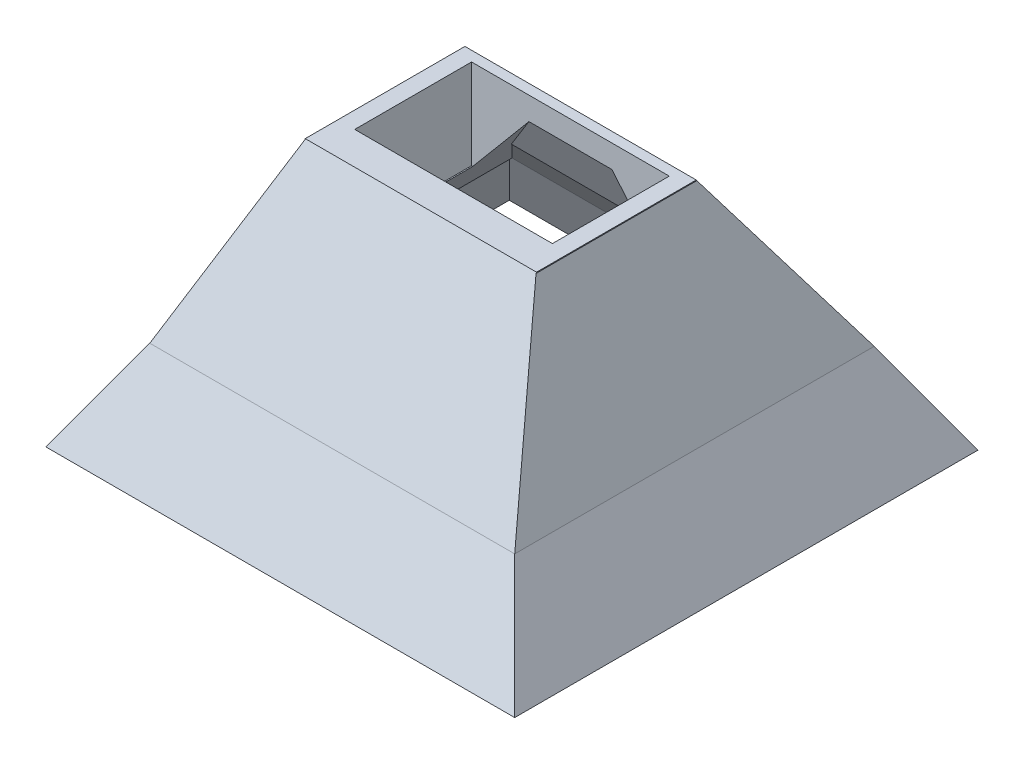
ISO-10303-21;
HEADER;
FILE_DESCRIPTION(('STEP AP214'),'2;1');
FILE_NAME('part.step','',(''),(''),'','','');
FILE_SCHEMA(('AUTOMOTIVE_DESIGN { 1 0 10303 214 1 1 1 1 }'));
ENDSEC;
DATA;
#1=APPLICATION_CONTEXT('core data for automotive mechanical design processes');
#2=APPLICATION_PROTOCOL_DEFINITION('international standard','automotive_design',2000,#1);
#3=PRODUCT_CONTEXT('',#1,'mechanical');
#4=PRODUCT('Part','Part','',(#3));
#5=PRODUCT_RELATED_PRODUCT_CATEGORY('part','',(#4));
#6=PRODUCT_DEFINITION_FORMATION('','',#4);
#7=PRODUCT_DEFINITION_CONTEXT('part definition',#1,'design');
#8=PRODUCT_DEFINITION('design','',#6,#7);
#9=PRODUCT_DEFINITION_SHAPE('','',#8);
#10=(LENGTH_UNIT() NAMED_UNIT(*) SI_UNIT(.MILLI.,.METRE.));
#11=(NAMED_UNIT(*) PLANE_ANGLE_UNIT() SI_UNIT($,.RADIAN.));
#12=(NAMED_UNIT(*) SI_UNIT($,.STERADIAN.) SOLID_ANGLE_UNIT());
#13=UNCERTAINTY_MEASURE_WITH_UNIT(LENGTH_MEASURE(1.E-05),#10,'distance_accuracy_value','');
#14=(GEOMETRIC_REPRESENTATION_CONTEXT(3) GLOBAL_UNCERTAINTY_ASSIGNED_CONTEXT((#13)) GLOBAL_UNIT_ASSIGNED_CONTEXT((#10,
#11,#12)) REPRESENTATION_CONTEXT('',''));
#15=CARTESIAN_POINT('',(0.,0.,0.));
#16=DIRECTION('',(0.,0.,1.));
#17=DIRECTION('',(1.,0.,0.));
#18=AXIS2_PLACEMENT_3D('',#15,#16,#17);
#19=CARTESIAN_POINT('',(0.,8.5,0.));
#20=DIRECTION('',(0.,-1.,0.));
#21=DIRECTION('',(0.,0.,-1.));
#22=AXIS2_PLACEMENT_3D('',#19,#20,#21);
#23=PLANE('',#22);
#24=DIRECTION('',(0.,0.,-1.));
#25=VECTOR('',#24,1.);
#26=CARTESIAN_POINT('',(-10.8676531349931,8.5,0.));
#27=LINE('',#26,#25);
#28=CARTESIAN_POINT('',(-10.8676531349931,8.5,10.8676531349931));
#29=VERTEX_POINT('',#28);
#30=CARTESIAN_POINT('',(-10.8676531349931,8.5,10.8));
#31=VERTEX_POINT('',#30);
#32=EDGE_CURVE('E426',#29,#31,#27,.T.);
#33=ORIENTED_EDGE('',*,*,#32,.T.);
#34=DIRECTION('',(1.,0.,0.));
#35=VECTOR('',#34,1.);
#36=CARTESIAN_POINT('',(10.8676531349931,8.5,10.8));
#37=LINE('',#36,#35);
#38=CARTESIAN_POINT('',(10.8676531349931,8.5,10.8));
#39=VERTEX_POINT('',#38);
#40=EDGE_CURVE('E485',#31,#39,#37,.T.);
#41=ORIENTED_EDGE('',*,*,#40,.T.);
#42=DIRECTION('',(0.,0.,1.));
#43=VECTOR('',#42,1.);
#44=CARTESIAN_POINT('',(10.8676531349931,8.5,0.));
#45=LINE('',#44,#43);
#46=CARTESIAN_POINT('',(10.8676531349931,8.5,10.8676531349931));
#47=VERTEX_POINT('',#46);
#48=EDGE_CURVE('E435',#39,#47,#45,.T.);
#49=ORIENTED_EDGE('',*,*,#48,.T.);
#50=DIRECTION('',(-1.,0.,0.));
#51=VECTOR('',#50,1.);
#52=CARTESIAN_POINT('',(0.,8.5,10.8676531349931));
#53=LINE('',#52,#51);
#54=EDGE_CURVE('E410',#47,#29,#53,.T.);
#55=ORIENTED_EDGE('',*,*,#54,.T.);
#56=EDGE_LOOP('',(#33,#41,#49,#55));
#57=FACE_BOUND('',#56,.T.);
#58=ADVANCED_FACE('F41',(#57),#23,.T.);
#59=CARTESIAN_POINT('',(18.,0.,-18.));
#60=DIRECTION('',(0.766044443118977,0.64278760968654,0.));
#61=DIRECTION('',(-0.64278760968654,0.766044443118977,0.));
#62=AXIS2_PLACEMENT_3D('',#59,#60,#61);
#63=PLANE('',#62);
#64=DIRECTION('',(0.540716203060937,-0.644400477571771,-0.540716203060937));
#65=VECTOR('',#64,1.);
#66=CARTESIAN_POINT('',(7.47453555890507,12.5437600613975,-7.47453555890508));
#67=LINE('',#66,#65);
#68=CARTESIAN_POINT('',(10.8676531349931,8.5,-10.8676531349931));
#69=VERTEX_POINT('',#68);
#70=CARTESIAN_POINT('',(18.,0.,-18.));
#71=VERTEX_POINT('',#70);
#72=EDGE_CURVE('E407',#69,#71,#67,.T.);
#73=ORIENTED_EDGE('',*,*,#72,.T.);
#74=DIRECTION('',(0.,0.,1.));
#75=VECTOR('',#74,1.);
#76=CARTESIAN_POINT('',(18.,0.,-18.));
#77=LINE('',#76,#75);
#78=CARTESIAN_POINT('',(18.,0.,18.));
#79=VERTEX_POINT('',#78);
#80=EDGE_CURVE('E236',#71,#79,#77,.T.);
#81=ORIENTED_EDGE('',*,*,#80,.T.);
#82=DIRECTION('',(0.540716203060937,-0.644400477571771,0.540716203060937));
#83=VECTOR('',#82,1.);
#84=CARTESIAN_POINT('',(7.47453555890506,12.5437600613975,7.47453555890507));
#85=LINE('',#84,#83);
#86=EDGE_CURVE('E406',#47,#79,#85,.T.);
#87=ORIENTED_EDGE('',*,*,#86,.F.);
#88=ORIENTED_EDGE('',*,*,#48,.F.);
#89=DIRECTION('',(-0.587858883152556,0.700582935935476,-0.404481746652007));
#90=VECTOR('',#89,1.);
#91=CARTESIAN_POINT('',(9.98509713369243,9.55178928521565,10.19274917305));
#92=LINE('',#91,#90);
#93=CARTESIAN_POINT('',(4.61819140160425,15.9478184725462,6.5));
#94=VERTEX_POINT('',#93);
#95=EDGE_CURVE('E51',#39,#94,#92,.T.);
#96=ORIENTED_EDGE('',*,*,#95,.T.);
#97=DIRECTION('',(-0.64278760968654,0.766044443118977,0.));
#98=VECTOR('',#97,1.);
#99=CARTESIAN_POINT('',(-3.09157313919248,25.1359580620961,6.5));
#100=LINE('',#99,#98);
#101=CARTESIAN_POINT('',(10.8676531349931,8.5,6.5));
#102=VERTEX_POINT('',#101);
#103=EDGE_CURVE('E474',#102,#94,#100,.T.);
#104=ORIENTED_EDGE('',*,*,#103,.F.);
#105=CARTESIAN_POINT('',(10.8676531349931,8.5,-6.5));
#106=VERTEX_POINT('',#105);
#107=EDGE_CURVE('E441',#106,#102,#45,.T.);
#108=ORIENTED_EDGE('',*,*,#107,.F.);
#109=DIRECTION('',(0.64278760968654,-0.766044443118977,0.));
#110=VECTOR('',#109,1.);
#111=CARTESIAN_POINT('',(-3.09157313919248,25.1359580620961,-6.5));
#112=LINE('',#111,#110);
#113=CARTESIAN_POINT('',(4.61819140160424,15.9478184725462,-6.5));
#114=VERTEX_POINT('',#113);
#115=EDGE_CURVE('E468',#114,#106,#112,.T.);
#116=ORIENTED_EDGE('',*,*,#115,.F.);
#117=DIRECTION('',(0.587858883152556,-0.700582935935476,-0.404481746652007));
#118=VECTOR('',#117,1.);
#119=CARTESIAN_POINT('',(18.5451118960204,-0.649639060448165,-16.0825465745377));
#120=LINE('',#119,#118);
#121=CARTESIAN_POINT('',(10.8676531349931,8.5,-10.8));
#122=VERTEX_POINT('',#121);
#123=EDGE_CURVE('E488',#114,#122,#120,.T.);
#124=ORIENTED_EDGE('',*,*,#123,.T.);
#125=EDGE_CURVE('E436',#69,#122,#45,.T.);
#126=ORIENTED_EDGE('',*,*,#125,.F.);
#127=EDGE_LOOP('',(#73,#81,#87,#88,#96,#104,#108,#116,#124,#126));
#128=FACE_BOUND('',#127,.T.);
#129=ADVANCED_FACE('F500',(#128),#63,.F.);
#130=CARTESIAN_POINT('',(-18.,0.,-18.));
#131=DIRECTION('',(0.,0.64278760968654,-0.766044443118977));
#132=DIRECTION('',(0.,0.766044443118977,0.64278760968654));
#133=AXIS2_PLACEMENT_3D('',#130,#131,#132);
#134=PLANE('',#133);
#135=DIRECTION('',(-0.540716203060937,-0.644400477571771,-0.540716203060937));
#136=VECTOR('',#135,1.);
#137=CARTESIAN_POINT('',(-18.,0.,-18.));
#138=LINE('',#137,#136);
#139=CARTESIAN_POINT('',(-10.8676531349931,8.5,-10.8676531349931));
#140=VERTEX_POINT('',#139);
#141=CARTESIAN_POINT('',(-18.,0.,-18.));
#142=VERTEX_POINT('',#141);
#143=EDGE_CURVE('E411',#140,#142,#138,.T.);
#144=ORIENTED_EDGE('',*,*,#143,.T.);
#145=DIRECTION('',(1.,0.,0.));
#146=VECTOR('',#145,1.);
#147=CARTESIAN_POINT('',(-18.,0.,-18.));
#148=LINE('',#147,#146);
#149=EDGE_CURVE('E402',#142,#71,#148,.T.);
#150=ORIENTED_EDGE('',*,*,#149,.T.);
#151=ORIENTED_EDGE('',*,*,#72,.F.);
#152=DIRECTION('',(1.,0.,0.));
#153=VECTOR('',#152,1.);
#154=CARTESIAN_POINT('',(0.,8.5,-10.8676531349931));
#155=LINE('',#154,#153);
#156=EDGE_CURVE('E430',#140,#69,#155,.T.);
#157=ORIENTED_EDGE('',*,*,#156,.F.);
#158=EDGE_LOOP('',(#144,#150,#151,#157));
#159=FACE_BOUND('',#158,.T.);
#160=ADVANCED_FACE('F581',(#159),#134,.F.);
#161=CARTESIAN_POINT('',(-18.,0.,-18.));
#162=DIRECTION('',(-0.766044443118977,0.64278760968654,0.));
#163=DIRECTION('',(-0.64278760968654,-0.766044443118977,0.));
#164=AXIS2_PLACEMENT_3D('',#161,#162,#163);
#165=PLANE('',#164);
#166=DIRECTION('',(-0.540716203060937,-0.644400477571771,0.540716203060937));
#167=VECTOR('',#166,1.);
#168=CARTESIAN_POINT('',(-18.,0.,18.));
#169=LINE('',#168,#167);
#170=CARTESIAN_POINT('',(-18.,0.,18.));
#171=VERTEX_POINT('',#170);
#172=EDGE_CURVE('E415',#29,#171,#169,.T.);
#173=ORIENTED_EDGE('',*,*,#172,.T.);
#174=DIRECTION('',(0.,0.,-1.));
#175=VECTOR('',#174,1.);
#176=CARTESIAN_POINT('',(-18.,0.,-18.));
#177=LINE('',#176,#175);
#178=EDGE_CURVE('E398',#171,#142,#177,.T.);
#179=ORIENTED_EDGE('',*,*,#178,.T.);
#180=ORIENTED_EDGE('',*,*,#143,.F.);
#181=CARTESIAN_POINT('',(-10.8676531349931,8.5,-10.8));
#182=VERTEX_POINT('',#181);
#183=EDGE_CURVE('E425',#182,#140,#27,.T.);
#184=ORIENTED_EDGE('',*,*,#183,.F.);
#185=DIRECTION('',(0.587858883152556,0.700582935935476,0.404481746652007));
#186=VECTOR('',#185,1.);
#187=CARTESIAN_POINT('',(-18.5451118960204,-0.649639060448165,-16.0825465745377));
#188=LINE('',#187,#186);
#189=CARTESIAN_POINT('',(-4.61819140160425,15.9478184725462,-6.5));
#190=VERTEX_POINT('',#189);
#191=EDGE_CURVE('E491',#182,#190,#188,.T.);
#192=ORIENTED_EDGE('',*,*,#191,.T.);
#193=DIRECTION('',(0.64278760968654,0.766044443118977,0.));
#194=VECTOR('',#193,1.);
#195=CARTESIAN_POINT('',(-5.99829690647131,14.3030727789618,-6.5));
#196=LINE('',#195,#194);
#197=CARTESIAN_POINT('',(-10.8676531349931,8.5,-6.5));
#198=VERTEX_POINT('',#197);
#199=EDGE_CURVE('E460',#198,#190,#196,.T.);
#200=ORIENTED_EDGE('',*,*,#199,.F.);
#201=CARTESIAN_POINT('',(-10.8676531349931,8.5,6.5));
#202=VERTEX_POINT('',#201);
#203=EDGE_CURVE('E431',#202,#198,#27,.T.);
#204=ORIENTED_EDGE('',*,*,#203,.F.);
#205=DIRECTION('',(-0.64278760968654,-0.766044443118977,0.));
#206=VECTOR('',#205,1.);
#207=CARTESIAN_POINT('',(-5.99829690647131,14.3030727789618,6.5));
#208=LINE('',#207,#206);
#209=CARTESIAN_POINT('',(-4.61819140160426,15.9478184725462,6.5));
#210=VERTEX_POINT('',#209);
#211=EDGE_CURVE('E482',#210,#202,#208,.T.);
#212=ORIENTED_EDGE('',*,*,#211,.F.);
#213=DIRECTION('',(-0.587858883152556,-0.700582935935476,0.404481746652007));
#214=VECTOR('',#213,1.);
#215=CARTESIAN_POINT('',(-9.98509713369243,9.55178928521565,10.19274917305));
#216=LINE('',#215,#214);
#217=EDGE_CURVE('E494',#210,#31,#216,.T.);
#218=ORIENTED_EDGE('',*,*,#217,.T.);
#219=ORIENTED_EDGE('',*,*,#32,.F.);
#220=EDGE_LOOP('',(#173,#179,#180,#184,#192,#200,#204,#212,#218,#219));
#221=FACE_BOUND('',#220,.T.);
#222=ADVANCED_FACE('F514',(#221),#165,.F.);
#223=CARTESIAN_POINT('',(-18.,0.,18.));
#224=DIRECTION('',(0.,0.64278760968654,0.766044443118977));
#225=DIRECTION('',(0.,-0.766044443118977,0.64278760968654));
#226=AXIS2_PLACEMENT_3D('',#223,#224,#225);
#227=PLANE('',#226);
#228=ORIENTED_EDGE('',*,*,#86,.T.);
#229=DIRECTION('',(-1.,0.,0.));
#230=VECTOR('',#229,1.);
#231=CARTESIAN_POINT('',(-18.,0.,18.));
#232=LINE('',#231,#230);
#233=EDGE_CURVE('E394',#79,#171,#232,.T.);
#234=ORIENTED_EDGE('',*,*,#233,.T.);
#235=ORIENTED_EDGE('',*,*,#172,.F.);
#236=ORIENTED_EDGE('',*,*,#54,.F.);
#237=EDGE_LOOP('',(#228,#234,#235,#236));
#238=FACE_BOUND('',#237,.T.);
#239=ADVANCED_FACE('F532',(#238),#227,.F.);
#240=ORIENTED_EDGE('',*,*,#125,.T.);
#241=DIRECTION('',(-1.,0.,0.));
#242=VECTOR('',#241,1.);
#243=CARTESIAN_POINT('',(-10.8676531349931,8.5,-10.8));
#244=LINE('',#243,#242);
#245=EDGE_CURVE('E471',#122,#182,#244,.T.);
#246=ORIENTED_EDGE('',*,*,#245,.T.);
#247=ORIENTED_EDGE('',*,*,#183,.T.);
#248=ORIENTED_EDGE('',*,*,#156,.T.);
#249=EDGE_LOOP('',(#240,#246,#247,#248));
#250=FACE_BOUND('',#249,.T.);
#251=ADVANCED_FACE('F550',(#250),#23,.T.);
#252=CARTESIAN_POINT('',(12.8676531349931,18.5,12.8676531349931));
#253=DIRECTION('',(-1.,0.,0.));
#254=DIRECTION('',(0.,0.,1.));
#255=AXIS2_PLACEMENT_3D('',#252,#253,#254);
#256=PLANE('',#255);
#257=DIRECTION('',(0.,0.,-1.));
#258=VECTOR('',#257,1.);
#259=CARTESIAN_POINT('',(12.8676531349931,18.398928629861,-12.8676531349931));
#260=LINE('',#259,#258);
#261=CARTESIAN_POINT('',(12.8676531349931,18.398928629861,10.1938683086254));
#262=VERTEX_POINT('',#261);
#263=CARTESIAN_POINT('',(12.8676531349931,18.398928629861,-7.69758123506049));
#264=VERTEX_POINT('',#263);
#265=EDGE_CURVE('E440',#262,#264,#260,.T.);
#266=ORIENTED_EDGE('',*,*,#265,.T.);
#267=DIRECTION('',(0.,0.831289081728702,0.555840321134273));
#268=VECTOR('',#267,1.);
#269=CARTESIAN_POINT('',(12.8676531349931,27.9712273961323,-1.29707660053211));
#270=LINE('',#269,#268);
#271=CARTESIAN_POINT('',(12.8676531349931,18.5,-7.63));
#272=VERTEX_POINT('',#271);
#273=EDGE_CURVE('E66',#264,#272,#270,.T.);
#274=ORIENTED_EDGE('',*,*,#273,.T.);
#275=DIRECTION('',(0.,0.,-1.));
#276=VECTOR('',#275,1.);
#277=CARTESIAN_POINT('',(12.8676531349931,18.5,12.8676531349931));
#278=LINE('',#277,#276);
#279=CARTESIAN_POINT('',(12.8676531349931,18.5,10.14));
#280=VERTEX_POINT('',#279);
#281=EDGE_CURVE('E376',#280,#272,#278,.T.);
#282=ORIENTED_EDGE('',*,*,#281,.F.);
#283=DIRECTION('',(0.,-0.88248495319256,0.470340629106954));
#284=VECTOR('',#283,1.);
#285=CARTESIAN_POINT('',(12.8676531349931,17.3678370281947,10.743412264973));
#286=LINE('',#285,#284);
#287=EDGE_CURVE('E323',#280,#262,#286,.T.);
#288=ORIENTED_EDGE('',*,*,#287,.T.);
#289=EDGE_LOOP('',(#266,#274,#282,#288));
#290=FACE_BOUND('',#289,.T.);
#291=ADVANCED_FACE('F586',(#290),#256,.F.);
#292=CARTESIAN_POINT('',(-12.8676531349931,18.5,12.8676531349931));
#293=DIRECTION('',(1.,0.,0.));
#294=DIRECTION('',(0.,0.,-1.));
#295=AXIS2_PLACEMENT_3D('',#292,#293,#294);
#296=PLANE('',#295);
#297=DIRECTION('',(0.,0.,1.));
#298=VECTOR('',#297,1.);
#299=CARTESIAN_POINT('',(-12.8676531349931,18.5,12.8676531349931));
#300=LINE('',#299,#298);
#301=CARTESIAN_POINT('',(-12.8676531349931,18.5,-7.63));
#302=VERTEX_POINT('',#301);
#303=CARTESIAN_POINT('',(-12.8676531349931,18.5,10.14));
#304=VERTEX_POINT('',#303);
#305=EDGE_CURVE('E389',#302,#304,#300,.T.);
#306=ORIENTED_EDGE('',*,*,#305,.F.);
#307=DIRECTION('',(0.,-0.831289081728702,-0.555840321134273));
#308=VECTOR('',#307,1.);
#309=CARTESIAN_POINT('',(-12.8676531349931,27.9712273961323,-1.29707660053211));
#310=LINE('',#309,#308);
#311=CARTESIAN_POINT('',(-12.8676531349931,18.398928629861,-7.69758123506048));
#312=VERTEX_POINT('',#311);
#313=EDGE_CURVE('E314',#302,#312,#310,.T.);
#314=ORIENTED_EDGE('',*,*,#313,.T.);
#315=DIRECTION('',(0.,0.,1.));
#316=VECTOR('',#315,1.);
#317=CARTESIAN_POINT('',(-12.8676531349931,18.398928629861,12.8676531349931));
#318=LINE('',#317,#316);
#319=CARTESIAN_POINT('',(-12.8676531349931,18.398928629861,10.1938683086254));
#320=VERTEX_POINT('',#319);
#321=EDGE_CURVE('E445',#312,#320,#318,.T.);
#322=ORIENTED_EDGE('',*,*,#321,.T.);
#323=DIRECTION('',(0.,0.88248495319256,-0.470340629106954));
#324=VECTOR('',#323,1.);
#325=CARTESIAN_POINT('',(-12.8676531349931,17.3678370281947,10.743412264973));
#326=LINE('',#325,#324);
#327=EDGE_CURVE('E333',#320,#304,#326,.T.);
#328=ORIENTED_EDGE('',*,*,#327,.T.);
#329=EDGE_LOOP('',(#306,#314,#322,#328));
#330=FACE_BOUND('',#329,.T.);
#331=ADVANCED_FACE('F591',(#330),#296,.F.);
#332=CARTESIAN_POINT('',(0.,18.5,0.));
#333=DIRECTION('',(0.,-1.,0.));
#334=DIRECTION('',(0.,0.,-1.));
#335=AXIS2_PLACEMENT_3D('',#332,#333,#334);
#336=PLANE('',#335);
#337=DIRECTION('',(1.,0.,0.));
#338=VECTOR('',#337,1.);
#339=CARTESIAN_POINT('',(-11.,18.5,-6.5));
#340=LINE('',#339,#338);
#341=CARTESIAN_POINT('',(-11.,18.5,-6.5));
#342=VERTEX_POINT('',#341);
#343=CARTESIAN_POINT('',(11.,18.5,-6.5));
#344=VERTEX_POINT('',#343);
#345=EDGE_CURVE('E351',#342,#344,#340,.T.);
#346=ORIENTED_EDGE('',*,*,#345,.T.);
#347=DIRECTION('',(0.,0.,1.));
#348=VECTOR('',#347,1.);
#349=CARTESIAN_POINT('',(11.,18.5,-6.5));
#350=LINE('',#349,#348);
#351=CARTESIAN_POINT('',(11.,18.5,6.5));
#352=VERTEX_POINT('',#351);
#353=EDGE_CURVE('E338',#344,#352,#350,.T.);
#354=ORIENTED_EDGE('',*,*,#353,.T.);
#355=DIRECTION('',(-1.,0.,0.));
#356=VECTOR('',#355,1.);
#357=CARTESIAN_POINT('',(-11.,18.5,6.5));
#358=LINE('',#357,#356);
#359=CARTESIAN_POINT('',(-11.,18.5,6.5));
#360=VERTEX_POINT('',#359);
#361=EDGE_CURVE('E342',#352,#360,#358,.T.);
#362=ORIENTED_EDGE('',*,*,#361,.T.);
#363=DIRECTION('',(0.,0.,-1.));
#364=VECTOR('',#363,1.);
#365=CARTESIAN_POINT('',(-11.,18.5,-6.5));
#366=LINE('',#365,#364);
#367=EDGE_CURVE('E347',#360,#342,#366,.T.);
#368=ORIENTED_EDGE('',*,*,#367,.T.);
#369=EDGE_LOOP('',(#346,#354,#362,#368));
#370=FACE_BOUND('',#369,.T.);
#371=ORIENTED_EDGE('',*,*,#281,.T.);
#372=DIRECTION('',(1.,0.,0.));
#373=VECTOR('',#372,1.);
#374=CARTESIAN_POINT('',(-20.3013028287262,18.5,-7.63));
#375=LINE('',#374,#373);
#376=EDGE_CURVE('E303',#302,#272,#375,.T.);
#377=ORIENTED_EDGE('',*,*,#376,.F.);
#378=ORIENTED_EDGE('',*,*,#305,.T.);
#379=DIRECTION('',(1.,0.,0.));
#380=VECTOR('',#379,1.);
#381=CARTESIAN_POINT('',(-20.3013028287262,18.5,10.14));
#382=LINE('',#381,#380);
#383=EDGE_CURVE('E319',#304,#280,#382,.T.);
#384=ORIENTED_EDGE('',*,*,#383,.T.);
#385=EDGE_LOOP('',(#371,#377,#378,#384));
#386=FACE_BOUND('',#385,.T.);
#387=ADVANCED_FACE('F562',(#370,#386),#336,.F.);
#388=CARTESIAN_POINT('',(0.,8.5,0.));
#389=DIRECTION('',(0.,1.,0.));
#390=DIRECTION('',(0.,0.,1.));
#391=AXIS2_PLACEMENT_3D('',#388,#389,#390);
#392=PLANE('',#391);
#393=ORIENTED_EDGE('',*,*,#203,.T.);
#394=DIRECTION('',(1.,0.,0.));
#395=VECTOR('',#394,1.);
#396=CARTESIAN_POINT('',(-11.,8.5,-6.5));
#397=LINE('',#396,#395);
#398=CARTESIAN_POINT('',(-11.,8.5,-6.5));
#399=VERTEX_POINT('',#398);
#400=EDGE_CURVE('E343',#399,#198,#397,.T.);
#401=ORIENTED_EDGE('',*,*,#400,.F.);
#402=DIRECTION('',(0.,0.,-1.));
#403=VECTOR('',#402,1.);
#404=CARTESIAN_POINT('',(-11.,8.5,-6.5));
#405=LINE('',#404,#403);
#406=CARTESIAN_POINT('',(-11.,8.5,6.5));
#407=VERTEX_POINT('',#406);
#408=EDGE_CURVE('E364',#407,#399,#405,.T.);
#409=ORIENTED_EDGE('',*,*,#408,.F.);
#410=DIRECTION('',(-1.,0.,0.));
#411=VECTOR('',#410,1.);
#412=CARTESIAN_POINT('',(-11.,8.5,6.5));
#413=LINE('',#412,#411);
#414=EDGE_CURVE('E359',#202,#407,#413,.T.);
#415=ORIENTED_EDGE('',*,*,#414,.F.);
#416=EDGE_LOOP('',(#393,#401,#409,#415));
#417=FACE_BOUND('',#416,.T.);
#418=ADVANCED_FACE('F520',(#417),#392,.T.);
#419=ORIENTED_EDGE('',*,*,#107,.T.);
#420=CARTESIAN_POINT('',(11.,8.5,6.5));
#421=VERTEX_POINT('',#420);
#422=EDGE_CURVE('E360',#421,#102,#413,.T.);
#423=ORIENTED_EDGE('',*,*,#422,.F.);
#424=DIRECTION('',(0.,0.,1.));
#425=VECTOR('',#424,1.);
#426=CARTESIAN_POINT('',(11.,8.5,-6.5));
#427=LINE('',#426,#425);
#428=CARTESIAN_POINT('',(11.,8.5,-6.5));
#429=VERTEX_POINT('',#428);
#430=EDGE_CURVE('E337',#429,#421,#427,.T.);
#431=ORIENTED_EDGE('',*,*,#430,.F.);
#432=EDGE_CURVE('E368',#106,#429,#397,.T.);
#433=ORIENTED_EDGE('',*,*,#432,.F.);
#434=EDGE_LOOP('',(#419,#423,#431,#433));
#435=FACE_BOUND('',#434,.T.);
#436=ADVANCED_FACE('F538',(#435),#392,.T.);
#437=CARTESIAN_POINT('',(11.,18.5,-6.5));
#438=DIRECTION('',(1.,0.,0.));
#439=DIRECTION('',(0.,0.,-1.));
#440=AXIS2_PLACEMENT_3D('',#437,#438,#439);
#441=PLANE('',#440);
#442=ORIENTED_EDGE('',*,*,#430,.T.);
#443=DIRECTION('',(0.,-1.,0.));
#444=VECTOR('',#443,1.);
#445=CARTESIAN_POINT('',(11.,18.5,6.5));
#446=LINE('',#445,#444);
#447=EDGE_CURVE('E355',#352,#421,#446,.T.);
#448=ORIENTED_EDGE('',*,*,#447,.F.);
#449=ORIENTED_EDGE('',*,*,#353,.F.);
#450=DIRECTION('',(0.,-1.,0.));
#451=VECTOR('',#450,1.);
#452=CARTESIAN_POINT('',(11.,18.5,-6.5));
#453=LINE('',#452,#451);
#454=EDGE_CURVE('E372',#344,#429,#453,.T.);
#455=ORIENTED_EDGE('',*,*,#454,.T.);
#456=EDGE_LOOP('',(#442,#448,#449,#455));
#457=FACE_BOUND('',#456,.T.);
#458=ADVANCED_FACE('F559',(#457),#441,.F.);
#459=CARTESIAN_POINT('',(-11.,18.5,-6.5));
#460=DIRECTION('',(0.,0.,-1.));
#461=DIRECTION('',(-1.,0.,0.));
#462=AXIS2_PLACEMENT_3D('',#459,#460,#461);
#463=PLANE('',#462);
#464=DIRECTION('',(1.,0.,0.));
#465=VECTOR('',#464,1.);
#466=CARTESIAN_POINT('',(10.8676531349931,15.9478184725462,-6.5));
#467=LINE('',#466,#465);
#468=EDGE_CURVE('E464',#190,#114,#467,.T.);
#469=ORIENTED_EDGE('',*,*,#468,.T.);
#470=ORIENTED_EDGE('',*,*,#115,.T.);
#471=ORIENTED_EDGE('',*,*,#432,.T.);
#472=ORIENTED_EDGE('',*,*,#454,.F.);
#473=ORIENTED_EDGE('',*,*,#345,.F.);
#474=DIRECTION('',(0.,-1.,0.));
#475=VECTOR('',#474,1.);
#476=CARTESIAN_POINT('',(-11.,18.5,-6.5));
#477=LINE('',#476,#475);
#478=EDGE_CURVE('E377',#342,#399,#477,.T.);
#479=ORIENTED_EDGE('',*,*,#478,.T.);
#480=ORIENTED_EDGE('',*,*,#400,.T.);
#481=ORIENTED_EDGE('',*,*,#199,.T.);
#482=EDGE_LOOP('',(#469,#470,#471,#472,#473,#479,#480,#481));
#483=FACE_BOUND('',#482,.T.);
#484=ADVANCED_FACE('F543',(#483),#463,.F.);
#485=CARTESIAN_POINT('',(-11.,18.5,-6.5));
#486=DIRECTION('',(-1.,0.,0.));
#487=DIRECTION('',(0.,0.,1.));
#488=AXIS2_PLACEMENT_3D('',#485,#486,#487);
#489=PLANE('',#488);
#490=ORIENTED_EDGE('',*,*,#408,.T.);
#491=ORIENTED_EDGE('',*,*,#478,.F.);
#492=ORIENTED_EDGE('',*,*,#367,.F.);
#493=DIRECTION('',(0.,-1.,0.));
#494=VECTOR('',#493,1.);
#495=CARTESIAN_POINT('',(-11.,18.5,6.5));
#496=LINE('',#495,#494);
#497=EDGE_CURVE('E380',#360,#407,#496,.T.);
#498=ORIENTED_EDGE('',*,*,#497,.T.);
#499=EDGE_LOOP('',(#490,#491,#492,#498));
#500=FACE_BOUND('',#499,.T.);
#501=ADVANCED_FACE('F565',(#500),#489,.F.);
#502=CARTESIAN_POINT('',(-11.,18.5,6.5));
#503=DIRECTION('',(0.,0.,1.));
#504=DIRECTION('',(1.,0.,0.));
#505=AXIS2_PLACEMENT_3D('',#502,#503,#504);
#506=PLANE('',#505);
#507=DIRECTION('',(-1.,0.,0.));
#508=VECTOR('',#507,1.);
#509=CARTESIAN_POINT('',(-10.8676531349931,15.9478184725462,6.5));
#510=LINE('',#509,#508);
#511=EDGE_CURVE('E478',#94,#210,#510,.T.);
#512=ORIENTED_EDGE('',*,*,#511,.T.);
#513=ORIENTED_EDGE('',*,*,#211,.T.);
#514=ORIENTED_EDGE('',*,*,#414,.T.);
#515=ORIENTED_EDGE('',*,*,#497,.F.);
#516=ORIENTED_EDGE('',*,*,#361,.F.);
#517=ORIENTED_EDGE('',*,*,#447,.T.);
#518=ORIENTED_EDGE('',*,*,#422,.T.);
#519=ORIENTED_EDGE('',*,*,#103,.T.);
#520=EDGE_LOOP('',(#512,#513,#514,#515,#516,#517,#518,#519));
#521=FACE_BOUND('',#520,.T.);
#522=ADVANCED_FACE('F507',(#521),#506,.F.);
#523=CARTESIAN_POINT('',(-12.8676531349931,18.398928629861,12.8676531349931));
#524=DIRECTION('',(0.927183854566789,-0.374606593415909,0.));
#525=DIRECTION('',(0.,0.,1.));
#526=AXIS2_PLACEMENT_3D('',#523,#524,#525);
#527=PLANE('',#526);
#528=ORIENTED_EDGE('',*,*,#321,.F.);
#529=DIRECTION('',(-0.318384822463637,-0.788030088407036,-0.52691525370784));
#530=VECTOR('',#529,1.);
#531=CARTESIAN_POINT('',(-9.417591998523,26.9381295922207,-1.98785605103943));
#532=LINE('',#531,#530);
#533=CARTESIAN_POINT('',(-20.3013028287262,0.,-20.));
#534=VERTEX_POINT('',#533);
#535=EDGE_CURVE('E311',#312,#534,#532,.T.);
#536=ORIENTED_EDGE('',*,*,#535,.T.);
#537=DIRECTION('',(0.,0.,-1.));
#538=VECTOR('',#537,1.);
#539=CARTESIAN_POINT('',(-20.3013028287262,0.,12.8676531349931));
#540=LINE('',#539,#538);
#541=CARTESIAN_POINT('',(-20.3013028287262,0.,20.));
#542=VERTEX_POINT('',#541);
#543=EDGE_CURVE('E452',#542,#534,#540,.T.);
#544=ORIENTED_EDGE('',*,*,#543,.F.);
#545=DIRECTION('',(0.335838644601319,0.83122981412188,-0.44302302525631));
#546=VECTOR('',#545,1.);
#547=CARTESIAN_POINT('',(-13.2654702112735,17.4142968142949,10.7186504546515));
#548=LINE('',#547,#546);
#549=EDGE_CURVE('E329',#542,#320,#548,.T.);
#550=ORIENTED_EDGE('',*,*,#549,.T.);
#551=EDGE_LOOP('',(#528,#536,#544,#550));
#552=FACE_BOUND('',#551,.T.);
#553=ADVANCED_FACE('F572',(#552),#527,.F.);
#554=CARTESIAN_POINT('',(12.8676531349931,18.398928629861,12.8676531349931));
#555=DIRECTION('',(-0.927183854566789,-0.374606593415909,0.));
#556=DIRECTION('',(0.,0.,-1.));
#557=AXIS2_PLACEMENT_3D('',#554,#555,#556);
#558=PLANE('',#557);
#559=DIRECTION('',(0.,0.,1.));
#560=VECTOR('',#559,1.);
#561=CARTESIAN_POINT('',(20.3013028287262,0.,12.8676531349931));
#562=LINE('',#561,#560);
#563=CARTESIAN_POINT('',(20.3013028287262,0.,-20.));
#564=VERTEX_POINT('',#563);
#565=CARTESIAN_POINT('',(20.3013028287262,0.,20.));
#566=VERTEX_POINT('',#565);
#567=EDGE_CURVE('E448',#564,#566,#562,.T.);
#568=ORIENTED_EDGE('',*,*,#567,.F.);
#569=DIRECTION('',(-0.318384822463637,0.788030088407036,0.52691525370784));
#570=VECTOR('',#569,1.);
#571=CARTESIAN_POINT('',(9.417591998523,26.9381295922207,-1.98785605103944));
#572=LINE('',#571,#570);
#573=EDGE_CURVE('E11',#564,#264,#572,.T.);
#574=ORIENTED_EDGE('',*,*,#573,.T.);
#575=ORIENTED_EDGE('',*,*,#265,.F.);
#576=DIRECTION('',(0.335838644601319,-0.83122981412188,0.44302302525631));
#577=VECTOR('',#576,1.);
#578=CARTESIAN_POINT('',(13.2654702112735,17.4142968142949,10.7186504546515));
#579=LINE('',#578,#577);
#580=EDGE_CURVE('E456',#262,#566,#579,.T.);
#581=ORIENTED_EDGE('',*,*,#580,.T.);
#582=EDGE_LOOP('',(#568,#574,#575,#581));
#583=FACE_BOUND('',#582,.T.);
#584=ADVANCED_FACE('F605',(#583),#558,.F.);
#585=CARTESIAN_POINT('',(-20.3013028287262,18.5,10.14));
#586=DIRECTION('',(0.,-0.470340629106954,-0.88248495319256));
#587=DIRECTION('',(0.,0.88248495319256,-0.470340629106954));
#588=AXIS2_PLACEMENT_3D('',#585,#586,#587);
#589=PLANE('',#588);
#590=ORIENTED_EDGE('',*,*,#549,.F.);
#591=DIRECTION('',(1.,0.,0.));
#592=VECTOR('',#591,1.);
#593=CARTESIAN_POINT('',(-20.3013028287262,0.,20.));
#594=LINE('',#593,#592);
#595=EDGE_CURVE('E318',#542,#566,#594,.T.);
#596=ORIENTED_EDGE('',*,*,#595,.T.);
#597=ORIENTED_EDGE('',*,*,#580,.F.);
#598=ORIENTED_EDGE('',*,*,#287,.F.);
#599=ORIENTED_EDGE('',*,*,#383,.F.);
#600=ORIENTED_EDGE('',*,*,#327,.F.);
#601=EDGE_LOOP('',(#590,#596,#597,#598,#599,#600));
#602=FACE_BOUND('',#601,.T.);
#603=ADVANCED_FACE('F612',(#602),#589,.F.);
#604=CARTESIAN_POINT('',(-11.,15.9478184725462,-6.5));
#605=DIRECTION('',(0.,-0.500000000000001,0.866025403784438));
#606=DIRECTION('',(-1.,0.,0.));
#607=AXIS2_PLACEMENT_3D('',#604,#605,#606);
#608=PLANE('',#607);
#609=ORIENTED_EDGE('',*,*,#191,.F.);
#610=ORIENTED_EDGE('',*,*,#245,.F.);
#611=ORIENTED_EDGE('',*,*,#123,.F.);
#612=ORIENTED_EDGE('',*,*,#468,.F.);
#613=EDGE_LOOP('',(#609,#610,#611,#612));
#614=FACE_BOUND('',#613,.T.);
#615=ADVANCED_FACE('F546',(#614),#608,.T.);
#616=CARTESIAN_POINT('',(-11.,15.9478184725462,6.5));
#617=DIRECTION('',(0.,-0.500000000000001,-0.866025403784438));
#618=DIRECTION('',(1.,0.,0.));
#619=AXIS2_PLACEMENT_3D('',#616,#617,#618);
#620=PLANE('',#619);
#621=ORIENTED_EDGE('',*,*,#95,.F.);
#622=ORIENTED_EDGE('',*,*,#40,.F.);
#623=ORIENTED_EDGE('',*,*,#217,.F.);
#624=ORIENTED_EDGE('',*,*,#511,.F.);
#625=EDGE_LOOP('',(#621,#622,#623,#624));
#626=FACE_BOUND('',#625,.T.);
#627=ADVANCED_FACE('F44',(#626),#620,.T.);
#628=CARTESIAN_POINT('',(-20.3013028287262,0.,-20.));
#629=DIRECTION('',(0.,-0.555840321134273,0.831289081728702));
#630=DIRECTION('',(0.,-0.831289081728702,-0.555840321134273));
#631=AXIS2_PLACEMENT_3D('',#628,#629,#630);
#632=PLANE('',#631);
#633=ORIENTED_EDGE('',*,*,#376,.T.);
#634=ORIENTED_EDGE('',*,*,#273,.F.);
#635=ORIENTED_EDGE('',*,*,#573,.F.);
#636=DIRECTION('',(1.,0.,0.));
#637=VECTOR('',#636,1.);
#638=CARTESIAN_POINT('',(-20.3013028287262,0.,-20.));
#639=LINE('',#638,#637);
#640=EDGE_CURVE('E278',#534,#564,#639,.T.);
#641=ORIENTED_EDGE('',*,*,#640,.F.);
#642=ORIENTED_EDGE('',*,*,#535,.F.);
#643=ORIENTED_EDGE('',*,*,#313,.F.);
#644=EDGE_LOOP('',(#633,#634,#635,#641,#642,#643));
#645=FACE_BOUND('',#644,.T.);
#646=ADVANCED_FACE('F625',(#645),#632,.F.);
#647=CARTESIAN_POINT('',(20.3013028287262,0.,-20.));
#648=DIRECTION('',(0.866025403784438,0.500000000000001,0.));
#649=DIRECTION('',(-0.500000000000001,0.866025403784438,0.));
#650=AXIS2_PLACEMENT_3D('',#647,#648,#649);
#651=PLANE('',#650);
#652=ORIENTED_EDGE('',*,*,#567,.T.);
#653=DIRECTION('',(-0.447213595499959,0.774596669241482,-0.447213595499959));
#654=VECTOR('',#653,1.);
#655=CARTESIAN_POINT('',(12.1807816972357,14.0651551836782,11.8794788685095));
#656=LINE('',#655,#654);
#657=CARTESIAN_POINT('',(26.0748055206225,-10.,25.7735026918963));
#658=VERTEX_POINT('',#657);
#659=EDGE_CURVE('E274',#658,#566,#656,.T.);
#660=ORIENTED_EDGE('',*,*,#659,.F.);
#661=DIRECTION('',(0.,0.,-1.));
#662=VECTOR('',#661,1.);
#663=CARTESIAN_POINT('',(26.0748055206225,-10.,0.));
#664=LINE('',#663,#662);
#665=CARTESIAN_POINT('',(26.0748055206225,-10.,-25.7735026918963));
#666=VERTEX_POINT('',#665);
#667=EDGE_CURVE('E258',#666,#658,#664,.F.);
#668=ORIENTED_EDGE('',*,*,#667,.F.);
#669=DIRECTION('',(-0.447213595499959,0.774596669241482,0.447213595499959));
#670=VECTOR('',#669,1.);
#671=CARTESIAN_POINT('',(20.3013028287262,0.,-20.));
#672=LINE('',#671,#670);
#673=EDGE_CURVE('E280',#666,#564,#672,.T.);
#674=ORIENTED_EDGE('',*,*,#673,.T.);
#675=EDGE_LOOP('',(#652,#660,#668,#674));
#676=FACE_BOUND('',#675,.T.);
#677=ADVANCED_FACE('F779',(#676),#651,.T.);
#678=CARTESIAN_POINT('',(-20.3013028287262,0.,20.));
#679=DIRECTION('',(0.,0.500000000000001,0.866025403784438));
#680=DIRECTION('',(0.,-0.866025403784438,0.500000000000001));
#681=AXIS2_PLACEMENT_3D('',#678,#679,#680);
#682=PLANE('',#681);
#683=ORIENTED_EDGE('',*,*,#595,.F.);
#684=DIRECTION('',(0.447213595499959,0.774596669241482,-0.447213595499959));
#685=VECTOR('',#684,1.);
#686=CARTESIAN_POINT('',(-12.3013028287262,13.856406460551,12.));
#687=LINE('',#686,#685);
#688=CARTESIAN_POINT('',(-26.0748055206225,-10.,25.7735026918963));
#689=VERTEX_POINT('',#688);
#690=EDGE_CURVE('E279',#689,#542,#687,.T.);
#691=ORIENTED_EDGE('',*,*,#690,.F.);
#692=DIRECTION('',(1.,0.,0.));
#693=VECTOR('',#692,1.);
#694=CARTESIAN_POINT('',(0.,-10.,25.7735026918963));
#695=LINE('',#694,#693);
#696=EDGE_CURVE('E295',#658,#689,#695,.F.);
#697=ORIENTED_EDGE('',*,*,#696,.F.);
#698=ORIENTED_EDGE('',*,*,#659,.T.);
#699=EDGE_LOOP('',(#683,#691,#697,#698));
#700=FACE_BOUND('',#699,.T.);
#701=ADVANCED_FACE('F769',(#700),#682,.T.);
#702=CARTESIAN_POINT('',(-20.3013028287262,0.,-20.));
#703=DIRECTION('',(-0.866025403784438,0.500000000000001,0.));
#704=DIRECTION('',(-0.500000000000001,-0.866025403784438,0.));
#705=AXIS2_PLACEMENT_3D('',#702,#703,#704);
#706=PLANE('',#705);
#707=ORIENTED_EDGE('',*,*,#543,.T.);
#708=DIRECTION('',(0.447213595499959,0.774596669241482,0.447213595499959));
#709=VECTOR('',#708,1.);
#710=CARTESIAN_POINT('',(-20.3013028287262,0.,-20.));
#711=LINE('',#710,#709);
#712=CARTESIAN_POINT('',(-26.0748055206225,-10.,-25.7735026918963));
#713=VERTEX_POINT('',#712);
#714=EDGE_CURVE('E284',#713,#534,#711,.T.);
#715=ORIENTED_EDGE('',*,*,#714,.F.);
#716=DIRECTION('',(0.,0.,1.));
#717=VECTOR('',#716,1.);
#718=CARTESIAN_POINT('',(-26.0748055206225,-10.,0.));
#719=LINE('',#718,#717);
#720=EDGE_CURVE('E298',#689,#713,#719,.F.);
#721=ORIENTED_EDGE('',*,*,#720,.F.);
#722=ORIENTED_EDGE('',*,*,#690,.T.);
#723=EDGE_LOOP('',(#707,#715,#721,#722));
#724=FACE_BOUND('',#723,.T.);
#725=ADVANCED_FACE('F757',(#724),#706,.T.);
#726=CARTESIAN_POINT('',(-20.3013028287262,0.,-20.));
#727=DIRECTION('',(0.,0.500000000000001,-0.866025403784438));
#728=DIRECTION('',(0.,0.866025403784438,0.500000000000001));
#729=AXIS2_PLACEMENT_3D('',#726,#727,#728);
#730=PLANE('',#729);
#731=ORIENTED_EDGE('',*,*,#640,.T.);
#732=ORIENTED_EDGE('',*,*,#673,.F.);
#733=DIRECTION('',(-1.,0.,0.));
#734=VECTOR('',#733,1.);
#735=CARTESIAN_POINT('',(0.,-10.,-25.7735026918963));
#736=LINE('',#735,#734);
#737=EDGE_CURVE('E285',#713,#666,#736,.F.);
#738=ORIENTED_EDGE('',*,*,#737,.F.);
#739=ORIENTED_EDGE('',*,*,#714,.T.);
#740=EDGE_LOOP('',(#731,#732,#738,#739));
#741=FACE_BOUND('',#740,.T.);
#742=ADVANCED_FACE('F749',(#741),#730,.T.);
#743=CARTESIAN_POINT('',(0.,-10.,0.));
#744=DIRECTION('',(0.,1.,0.));
#745=DIRECTION('',(0.,0.,1.));
#746=AXIS2_PLACEMENT_3D('',#743,#744,#745);
#747=PLANE('',#746);
#748=DIRECTION('',(1.,0.,0.));
#749=VECTOR('',#748,1.);
#750=CARTESIAN_POINT('',(-18.3013028287262,-10.,23.7735026918963));
#751=LINE('',#750,#749);
#752=CARTESIAN_POINT('',(-24.0748055206225,-10.,23.7735026918963));
#753=VERTEX_POINT('',#752);
#754=CARTESIAN_POINT('',(24.0748055206225,-10.,23.7735026918963));
#755=VERTEX_POINT('',#754);
#756=EDGE_CURVE('E229',#753,#755,#751,.T.);
#757=ORIENTED_EDGE('',*,*,#756,.T.);
#758=DIRECTION('',(0.,0.,-1.));
#759=VECTOR('',#758,1.);
#760=CARTESIAN_POINT('',(24.0748055206225,-10.,18.));
#761=LINE('',#760,#759);
#762=CARTESIAN_POINT('',(24.0748055206225,-10.,-23.7735026918963));
#763=VERTEX_POINT('',#762);
#764=EDGE_CURVE('E256',#755,#763,#761,.T.);
#765=ORIENTED_EDGE('',*,*,#764,.T.);
#766=DIRECTION('',(-1.,0.,0.));
#767=VECTOR('',#766,1.);
#768=CARTESIAN_POINT('',(-18.3013028287262,-10.,-23.7735026918963));
#769=LINE('',#768,#767);
#770=CARTESIAN_POINT('',(-24.0748055206225,-10.,-23.7735026918963));
#771=VERTEX_POINT('',#770);
#772=EDGE_CURVE('E222',#763,#771,#769,.T.);
#773=ORIENTED_EDGE('',*,*,#772,.T.);
#774=DIRECTION('',(0.,0.,1.));
#775=VECTOR('',#774,1.);
#776=CARTESIAN_POINT('',(-24.0748055206225,-10.,18.));
#777=LINE('',#776,#775);
#778=EDGE_CURVE('E58',#771,#753,#777,.T.);
#779=ORIENTED_EDGE('',*,*,#778,.T.);
#780=EDGE_LOOP('',(#757,#765,#773,#779));
#781=FACE_BOUND('',#780,.T.);
#782=ORIENTED_EDGE('',*,*,#667,.T.);
#783=ORIENTED_EDGE('',*,*,#696,.T.);
#784=ORIENTED_EDGE('',*,*,#720,.T.);
#785=ORIENTED_EDGE('',*,*,#737,.T.);
#786=EDGE_LOOP('',(#782,#783,#784,#785));
#787=FACE_BOUND('',#786,.T.);
#788=ADVANCED_FACE('F756',(#781,#787),#747,.F.);
#789=CARTESIAN_POINT('',(0.,0.,0.));
#790=DIRECTION('',(0.,-1.,0.));
#791=DIRECTION('',(0.,0.,-1.));
#792=AXIS2_PLACEMENT_3D('',#789,#790,#791);
#793=PLANE('',#792);
#794=DIRECTION('',(-1.,0.,0.));
#795=VECTOR('',#794,1.);
#796=CARTESIAN_POINT('',(-18.3013028287262,0.,-18.));
#797=LINE('',#796,#795);
#798=CARTESIAN_POINT('',(18.3013028287262,0.,-18.));
#799=VERTEX_POINT('',#798);
#800=EDGE_CURVE('E219',#799,#71,#797,.T.);
#801=ORIENTED_EDGE('',*,*,#800,.F.);
#802=DIRECTION('',(0.,0.,-1.));
#803=VECTOR('',#802,1.);
#804=CARTESIAN_POINT('',(18.3013028287262,0.,18.));
#805=LINE('',#804,#803);
#806=CARTESIAN_POINT('',(18.3013028287262,0.,18.));
#807=VERTEX_POINT('',#806);
#808=EDGE_CURVE('E234',#807,#799,#805,.T.);
#809=ORIENTED_EDGE('',*,*,#808,.F.);
#810=DIRECTION('',(1.,0.,0.));
#811=VECTOR('',#810,1.);
#812=CARTESIAN_POINT('',(-18.3013028287262,0.,18.));
#813=LINE('',#812,#811);
#814=EDGE_CURVE('E251',#79,#807,#813,.T.);
#815=ORIENTED_EDGE('',*,*,#814,.F.);
#816=ORIENTED_EDGE('',*,*,#80,.F.);
#817=EDGE_LOOP('',(#801,#809,#815,#816));
#818=FACE_BOUND('',#817,.T.);
#819=ADVANCED_FACE('F233',(#818),#793,.T.);
#820=CARTESIAN_POINT('',(18.3013028287262,0.,18.));
#821=DIRECTION('',(0.866025403784438,0.500000000000001,0.));
#822=DIRECTION('',(-0.500000000000001,0.866025403784438,0.));
#823=AXIS2_PLACEMENT_3D('',#820,#821,#822);
#824=PLANE('',#823);
#825=ORIENTED_EDGE('',*,*,#808,.T.);
#826=DIRECTION('',(-0.447213595499959,0.774596669241482,0.447213595499959));
#827=VECTOR('',#826,1.);
#828=CARTESIAN_POINT('',(11.1013028287262,12.4707658144959,-10.8));
#829=LINE('',#828,#827);
#830=EDGE_CURVE('E216',#763,#799,#829,.T.);
#831=ORIENTED_EDGE('',*,*,#830,.F.);
#832=ORIENTED_EDGE('',*,*,#764,.F.);
#833=DIRECTION('',(-0.447213595499959,0.774596669241482,-0.447213595499959));
#834=VECTOR('',#833,1.);
#835=CARTESIAN_POINT('',(10.9807816972357,12.6795145376231,10.6794788685095));
#836=LINE('',#835,#834);
#837=EDGE_CURVE('E243',#755,#807,#836,.T.);
#838=ORIENTED_EDGE('',*,*,#837,.T.);
#839=EDGE_LOOP('',(#825,#831,#832,#838));
#840=FACE_BOUND('',#839,.T.);
#841=ADVANCED_FACE('F242',(#840),#824,.F.);
#842=CARTESIAN_POINT('',(-18.3013028287262,0.,18.));
#843=DIRECTION('',(0.,0.500000000000001,0.866025403784438));
#844=DIRECTION('',(0.,-0.866025403784438,0.500000000000001));
#845=AXIS2_PLACEMENT_3D('',#842,#843,#844);
#846=PLANE('',#845);
#847=CARTESIAN_POINT('',(-18.3013028287262,0.,18.));
#848=VERTEX_POINT('',#847);
#849=EDGE_CURVE('E252',#848,#171,#813,.T.);
#850=ORIENTED_EDGE('',*,*,#849,.T.);
#851=ORIENTED_EDGE('',*,*,#233,.F.);
#852=ORIENTED_EDGE('',*,*,#814,.T.);
#853=ORIENTED_EDGE('',*,*,#837,.F.);
#854=ORIENTED_EDGE('',*,*,#756,.F.);
#855=DIRECTION('',(0.447213595499959,0.774596669241482,-0.447213595499959));
#856=VECTOR('',#855,1.);
#857=CARTESIAN_POINT('',(-18.3013028287262,0.,18.));
#858=LINE('',#857,#856);
#859=EDGE_CURVE('E259',#753,#848,#858,.T.);
#860=ORIENTED_EDGE('',*,*,#859,.T.);
#861=EDGE_LOOP('',(#850,#851,#852,#853,#854,#860));
#862=FACE_BOUND('',#861,.T.);
#863=ADVANCED_FACE('F526',(#862),#846,.F.);
#864=CARTESIAN_POINT('',(-18.3013028287262,0.,18.));
#865=DIRECTION('',(-0.866025403784438,0.500000000000001,0.));
#866=DIRECTION('',(-0.500000000000001,-0.866025403784438,0.));
#867=AXIS2_PLACEMENT_3D('',#864,#865,#866);
#868=PLANE('',#867);
#869=DIRECTION('',(0.,0.,1.));
#870=VECTOR('',#869,1.);
#871=CARTESIAN_POINT('',(-18.3013028287262,0.,18.));
#872=LINE('',#871,#870);
#873=CARTESIAN_POINT('',(-18.3013028287262,0.,-18.));
#874=VERTEX_POINT('',#873);
#875=EDGE_CURVE('E238',#874,#848,#872,.T.);
#876=ORIENTED_EDGE('',*,*,#875,.T.);
#877=ORIENTED_EDGE('',*,*,#859,.F.);
#878=ORIENTED_EDGE('',*,*,#778,.F.);
#879=DIRECTION('',(0.447213595499959,0.774596669241482,0.447213595499959));
#880=VECTOR('',#879,1.);
#881=CARTESIAN_POINT('',(-18.3013028287262,0.,-18.));
#882=LINE('',#881,#880);
#883=EDGE_CURVE('E228',#771,#874,#882,.T.);
#884=ORIENTED_EDGE('',*,*,#883,.T.);
#885=EDGE_LOOP('',(#876,#877,#878,#884));
#886=FACE_BOUND('',#885,.T.);
#887=ADVANCED_FACE('F824',(#886),#868,.F.);
#888=CARTESIAN_POINT('',(-18.3013028287262,0.,-18.));
#889=DIRECTION('',(0.,0.500000000000001,-0.866025403784438));
#890=DIRECTION('',(0.,0.866025403784438,0.500000000000001));
#891=AXIS2_PLACEMENT_3D('',#888,#889,#890);
#892=PLANE('',#891);
#893=ORIENTED_EDGE('',*,*,#800,.T.);
#894=ORIENTED_EDGE('',*,*,#149,.F.);
#895=EDGE_CURVE('E239',#142,#874,#797,.T.);
#896=ORIENTED_EDGE('',*,*,#895,.T.);
#897=ORIENTED_EDGE('',*,*,#883,.F.);
#898=ORIENTED_EDGE('',*,*,#772,.F.);
#899=ORIENTED_EDGE('',*,*,#830,.T.);
#900=EDGE_LOOP('',(#893,#894,#896,#897,#898,#899));
#901=FACE_BOUND('',#900,.T.);
#902=ADVANCED_FACE('F218',(#901),#892,.F.);
#903=ORIENTED_EDGE('',*,*,#849,.F.);
#904=ORIENTED_EDGE('',*,*,#875,.F.);
#905=ORIENTED_EDGE('',*,*,#895,.F.);
#906=ORIENTED_EDGE('',*,*,#178,.F.);
#907=EDGE_LOOP('',(#903,#904,#905,#906));
#908=FACE_BOUND('',#907,.T.);
#909=ADVANCED_FACE('F820',(#908),#793,.T.);
#910=CLOSED_SHELL('',(#58,#129,#160,#222,#239,#251,#291,#331,#387,#418,#436,#458,#484,#501,#522,
#553,#584,#603,#615,#627,#646,#677,#701,#725,#742,#788,#819,#841,#863,#887,#902,#909));
#911=MANIFOLD_SOLID_BREP('B2',#910);
#912=ADVANCED_BREP_SHAPE_REPRESENTATION('',(#18,#911),#14);
#913=SHAPE_DEFINITION_REPRESENTATION(#9,#912);
ENDSEC;
END-ISO-10303-21;
